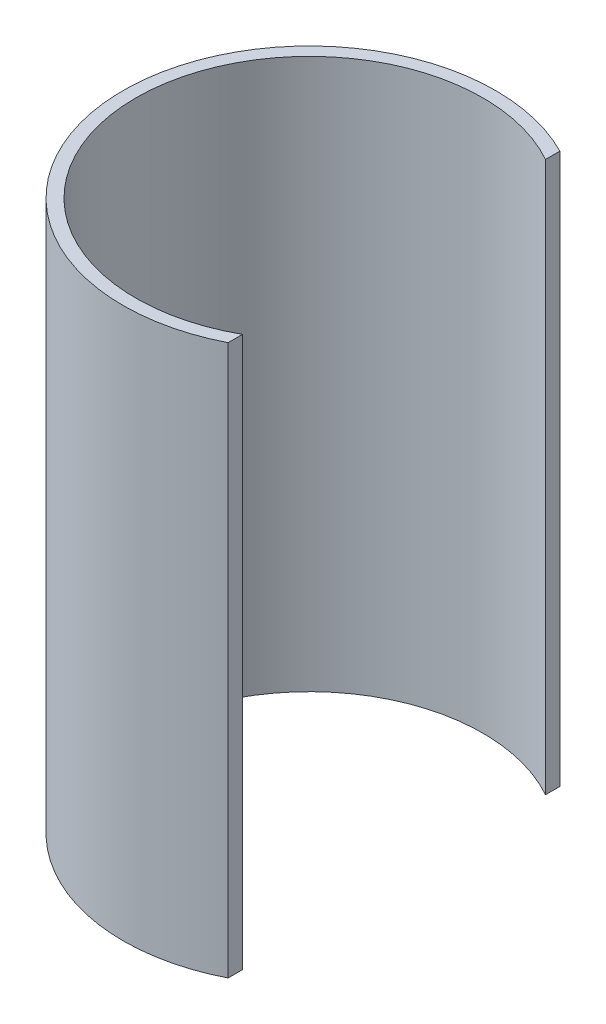
ISO-10303-21;
HEADER;
FILE_DESCRIPTION(('STEP AP214'),'2;1');
FILE_NAME('part.step','',(''),(''),'','','');
FILE_SCHEMA(('AUTOMOTIVE_DESIGN { 1 0 10303 214 1 1 1 1 }'));
ENDSEC;
DATA;
#1=APPLICATION_CONTEXT('core data for automotive mechanical design processes');
#2=APPLICATION_PROTOCOL_DEFINITION('international standard','automotive_design',2000,#1);
#3=PRODUCT_CONTEXT('',#1,'mechanical');
#4=PRODUCT('Part','Part','',(#3));
#5=PRODUCT_RELATED_PRODUCT_CATEGORY('part','',(#4));
#6=PRODUCT_DEFINITION_FORMATION('','',#4);
#7=PRODUCT_DEFINITION_CONTEXT('part definition',#1,'design');
#8=PRODUCT_DEFINITION('design','',#6,#7);
#9=PRODUCT_DEFINITION_SHAPE('','',#8);
#10=(LENGTH_UNIT() NAMED_UNIT(*) SI_UNIT(.MILLI.,.METRE.));
#11=(NAMED_UNIT(*) PLANE_ANGLE_UNIT() SI_UNIT($,.RADIAN.));
#12=(NAMED_UNIT(*) SI_UNIT($,.STERADIAN.) SOLID_ANGLE_UNIT());
#13=UNCERTAINTY_MEASURE_WITH_UNIT(LENGTH_MEASURE(1.E-05),#10,'distance_accuracy_value','');
#14=(GEOMETRIC_REPRESENTATION_CONTEXT(3) GLOBAL_UNCERTAINTY_ASSIGNED_CONTEXT((#13)) GLOBAL_UNIT_ASSIGNED_CONTEXT((#10,
#11,#12)) REPRESENTATION_CONTEXT('',''));
#15=CARTESIAN_POINT('',(0.,0.,0.));
#16=DIRECTION('',(0.,0.,1.));
#17=DIRECTION('',(1.,0.,0.));
#18=AXIS2_PLACEMENT_3D('',#15,#16,#17);
#19=CARTESIAN_POINT('',(0.,76.1415285451197,0.));
#20=DIRECTION('',(0.,1.,0.));
#21=DIRECTION('',(0.,0.,1.00000000000007));
#22=AXIS2_PLACEMENT_3D('',#19,#20,#21);
#23=CYLINDRICAL_SURFACE('',#22,41.);
#24=CARTESIAN_POINT('',(0.,130.,0.));
#25=DIRECTION('',(0.,1.,0.));
#26=DIRECTION('',(0.,0.,1.00000000000007));
#27=AXIS2_PLACEMENT_3D('',#24,#25,#26);
#28=CIRCLE('',#27,41.);
#29=CARTESIAN_POINT('',(20.0000000000021,130.,-35.7910603363465));
#30=VERTEX_POINT('',#29);
#31=CARTESIAN_POINT('',(20.0000000000028,130.,35.7910603363489));
#32=VERTEX_POINT('',#31);
#33=EDGE_CURVE('E103',#30,#32,#28,.T.);
#34=ORIENTED_EDGE('',*,*,#33,.T.);
#35=DIRECTION('',(0.,1.,0.));
#36=VECTOR('',#35,1.);
#37=CARTESIAN_POINT('',(20.0000000000028,76.1415285451197,35.7910603363489));
#38=LINE('',#37,#36);
#39=CARTESIAN_POINT('',(20.0000000000028,0.,35.7910603363489));
#40=VERTEX_POINT('',#39);
#41=EDGE_CURVE('E105',#32,#40,#38,.F.);
#42=ORIENTED_EDGE('',*,*,#41,.T.);
#43=CARTESIAN_POINT('',(0.,0.,0.));
#44=DIRECTION('',(0.,1.,0.));
#45=DIRECTION('',(0.,0.,1.00000000000007));
#46=AXIS2_PLACEMENT_3D('',#43,#44,#45);
#47=CIRCLE('',#46,41.);
#48=CARTESIAN_POINT('',(20.0000000000022,0.,-35.7910603363465));
#49=VERTEX_POINT('',#48);
#50=EDGE_CURVE('E98',#49,#40,#47,.T.);
#51=ORIENTED_EDGE('',*,*,#50,.F.);
#52=DIRECTION('',(0.,1.,0.));
#53=VECTOR('',#52,1.);
#54=CARTESIAN_POINT('',(20.0000000000022,76.1415285451197,-35.7910603363465));
#55=LINE('',#54,#53);
#56=EDGE_CURVE('E56',#49,#30,#55,.T.);
#57=ORIENTED_EDGE('',*,*,#56,.T.);
#58=EDGE_LOOP('',(#34,#42,#51,#57));
#59=FACE_BOUND('',#58,.T.);
#60=ADVANCED_FACE('F41',(#59),#23,.F.);
#61=CARTESIAN_POINT('',(41.0000000000048,130.,1.26287869051112E-12));
#62=DIRECTION('',(0.,-1.,0.));
#63=DIRECTION('',(0.,0.,-1.00000000000007));
#64=AXIS2_PLACEMENT_3D('',#61,#62,#63);
#65=PLANE('',#64);
#66=CARTESIAN_POINT('',(0.,130.,0.));
#67=DIRECTION('',(0.,1.,0.));
#68=DIRECTION('',(0.,0.,1.00000000000007));
#69=AXIS2_PLACEMENT_3D('',#66,#67,#68);
#70=CIRCLE('',#69,44.);
#71=CARTESIAN_POINT('',(20.0000000000032,130.,-39.1918358845312));
#72=VERTEX_POINT('',#71);
#73=CARTESIAN_POINT('',(20.0000000000023,130.,39.1918358845352));
#74=VERTEX_POINT('',#73);
#75=EDGE_CURVE('E92',#72,#74,#70,.T.);
#76=ORIENTED_EDGE('',*,*,#75,.T.);
#77=DIRECTION('',(0.,0.,1.00000000000007));
#78=VECTOR('',#77,1.);
#79=CARTESIAN_POINT('',(20.0000000000026,130.,-44.0000000000027));
#80=LINE('',#79,#78);
#81=EDGE_CURVE('E120',#32,#74,#80,.T.);
#82=ORIENTED_EDGE('',*,*,#81,.F.);
#83=ORIENTED_EDGE('',*,*,#33,.F.);
#84=EDGE_CURVE('E94',#72,#30,#80,.T.);
#85=ORIENTED_EDGE('',*,*,#84,.F.);
#86=EDGE_LOOP('',(#76,#82,#83,#85));
#87=FACE_BOUND('',#86,.T.);
#88=ADVANCED_FACE('F119',(#87),#65,.F.);
#89=CARTESIAN_POINT('',(0.,76.1415285451197,0.));
#90=DIRECTION('',(0.,1.,0.));
#91=DIRECTION('',(0.,0.,1.00000000000007));
#92=AXIS2_PLACEMENT_3D('',#89,#90,#91);
#93=CYLINDRICAL_SURFACE('',#92,44.);
#94=CARTESIAN_POINT('',(0.,0.,0.));
#95=DIRECTION('',(0.,1.,0.));
#96=DIRECTION('',(0.,0.,1.00000000000007));
#97=AXIS2_PLACEMENT_3D('',#94,#95,#96);
#98=CIRCLE('',#97,44.);
#99=CARTESIAN_POINT('',(20.0000000000032,0.,-39.1918358845312));
#100=VERTEX_POINT('',#99);
#101=CARTESIAN_POINT('',(20.0000000000023,0.,39.1918358845352));
#102=VERTEX_POINT('',#101);
#103=EDGE_CURVE('E90',#100,#102,#98,.T.);
#104=ORIENTED_EDGE('',*,*,#103,.T.);
#105=DIRECTION('',(0.,1.,0.));
#106=VECTOR('',#105,1.);
#107=CARTESIAN_POINT('',(20.0000000000023,76.1415285451197,39.1918358845352));
#108=LINE('',#107,#106);
#109=EDGE_CURVE('E63',#102,#74,#108,.T.);
#110=ORIENTED_EDGE('',*,*,#109,.T.);
#111=ORIENTED_EDGE('',*,*,#75,.F.);
#112=DIRECTION('',(0.,1.,0.));
#113=VECTOR('',#112,1.);
#114=CARTESIAN_POINT('',(20.0000000000032,76.1415285451197,-39.1918358845312));
#115=LINE('',#114,#113);
#116=EDGE_CURVE('E80',#72,#100,#115,.F.);
#117=ORIENTED_EDGE('',*,*,#116,.T.);
#118=EDGE_LOOP('',(#104,#110,#111,#117));
#119=FACE_BOUND('',#118,.T.);
#120=ADVANCED_FACE('F89',(#119),#93,.T.);
#121=CARTESIAN_POINT('',(41.0000000000048,0.,1.26287869051112E-12));
#122=DIRECTION('',(0.,1.,0.));
#123=DIRECTION('',(0.,0.,1.00000000000007));
#124=AXIS2_PLACEMENT_3D('',#121,#122,#123);
#125=PLANE('',#124);
#126=ORIENTED_EDGE('',*,*,#103,.F.);
#127=DIRECTION('',(0.,0.,1.00000000000007));
#128=VECTOR('',#127,1.);
#129=CARTESIAN_POINT('',(20.0000000000022,0.,0.));
#130=LINE('',#129,#128);
#131=EDGE_CURVE('E11',#100,#49,#130,.T.);
#132=ORIENTED_EDGE('',*,*,#131,.T.);
#133=ORIENTED_EDGE('',*,*,#50,.T.);
#134=EDGE_CURVE('E44',#40,#102,#130,.T.);
#135=ORIENTED_EDGE('',*,*,#134,.T.);
#136=EDGE_LOOP('',(#126,#132,#133,#135));
#137=FACE_BOUND('',#136,.T.);
#138=ADVANCED_FACE('F96',(#137),#125,.F.);
#139=CARTESIAN_POINT('',(20.0000000000026,130.,-44.0000000000027));
#140=DIRECTION('',(-1.00000000000007,0.,0.));
#141=DIRECTION('',(0.,-1.,0.));
#142=AXIS2_PLACEMENT_3D('',#139,#140,#141);
#143=PLANE('',#142);
#144=ORIENTED_EDGE('',*,*,#81,.T.);
#145=ORIENTED_EDGE('',*,*,#109,.F.);
#146=ORIENTED_EDGE('',*,*,#134,.F.);
#147=ORIENTED_EDGE('',*,*,#41,.F.);
#148=EDGE_LOOP('',(#144,#145,#146,#147));
#149=FACE_BOUND('',#148,.T.);
#150=ADVANCED_FACE('F136',(#149),#143,.F.);
#151=ORIENTED_EDGE('',*,*,#131,.F.);
#152=ORIENTED_EDGE('',*,*,#116,.F.);
#153=ORIENTED_EDGE('',*,*,#84,.T.);
#154=ORIENTED_EDGE('',*,*,#56,.F.);
#155=EDGE_LOOP('',(#151,#152,#153,#154));
#156=FACE_BOUND('',#155,.T.);
#157=ADVANCED_FACE('F79',(#156),#143,.F.);
#158=CLOSED_SHELL('',(#60,#88,#120,#138,#150,#157));
#159=MANIFOLD_SOLID_BREP('B2',#158);
#160=ADVANCED_BREP_SHAPE_REPRESENTATION('',(#18,#159),#14);
#161=SHAPE_DEFINITION_REPRESENTATION(#9,#160);
ENDSEC;
END-ISO-10303-21;
